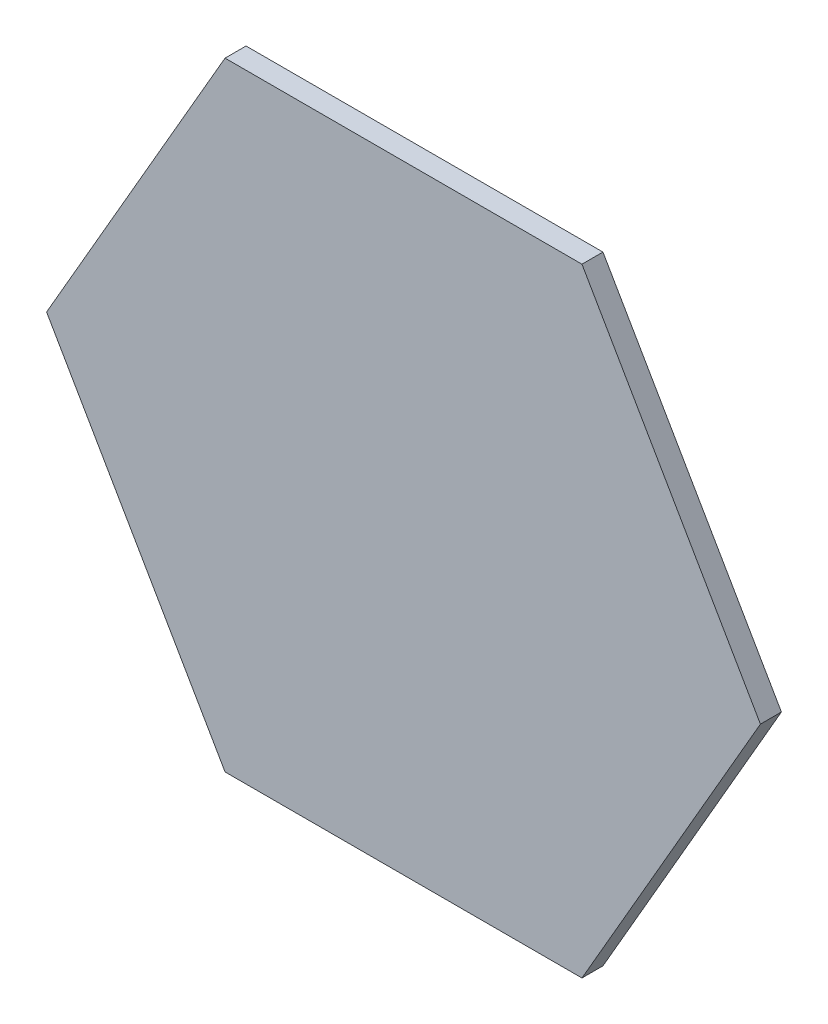
ISO-10303-21;
HEADER;
FILE_DESCRIPTION(('STEP AP214'),'2;1');
FILE_NAME('part.step','',(''),(''),'','','');
FILE_SCHEMA(('AUTOMOTIVE_DESIGN { 1 0 10303 214 1 1 1 1 }'));
ENDSEC;
DATA;
#1=APPLICATION_CONTEXT('core data for automotive mechanical design processes');
#2=APPLICATION_PROTOCOL_DEFINITION('international standard','automotive_design',2000,#1);
#3=PRODUCT_CONTEXT('',#1,'mechanical');
#4=PRODUCT('Part','Part','',(#3));
#5=PRODUCT_RELATED_PRODUCT_CATEGORY('part','',(#4));
#6=PRODUCT_DEFINITION_FORMATION('','',#4);
#7=PRODUCT_DEFINITION_CONTEXT('part definition',#1,'design');
#8=PRODUCT_DEFINITION('design','',#6,#7);
#9=PRODUCT_DEFINITION_SHAPE('','',#8);
#10=(LENGTH_UNIT() NAMED_UNIT(*) SI_UNIT(.MILLI.,.METRE.));
#11=(NAMED_UNIT(*) PLANE_ANGLE_UNIT() SI_UNIT($,.RADIAN.));
#12=(NAMED_UNIT(*) SI_UNIT($,.STERADIAN.) SOLID_ANGLE_UNIT());
#13=UNCERTAINTY_MEASURE_WITH_UNIT(LENGTH_MEASURE(1.E-05),#10,'distance_accuracy_value','');
#14=(GEOMETRIC_REPRESENTATION_CONTEXT(3) GLOBAL_UNCERTAINTY_ASSIGNED_CONTEXT((#13)) GLOBAL_UNIT_ASSIGNED_CONTEXT((#10,
#11,#12)) REPRESENTATION_CONTEXT('',''));
#15=CARTESIAN_POINT('',(0.,0.,0.));
#16=DIRECTION('',(0.,0.,1.));
#17=DIRECTION('',(1.,0.,0.));
#18=AXIS2_PLACEMENT_3D('',#15,#16,#17);
#19=CARTESIAN_POINT('',(17.0000000000003,-29.4448637286707,2.));
#20=DIRECTION('',(-0.866025403784441,0.499999999999995,0.));
#21=DIRECTION('',(-0.499999999999995,-0.866025403784442,0.));
#22=AXIS2_PLACEMENT_3D('',#19,#20,#21);
#23=PLANE('',#22);
#24=DIRECTION('',(0.499999999999995,0.866025403784441,0.));
#25=VECTOR('',#24,1.);
#26=CARTESIAN_POINT('',(17.0000000000003,-29.4448637286707,0.));
#27=LINE('',#26,#25);
#28=CARTESIAN_POINT('',(17.0000000000003,-29.4448637286707,0.));
#29=VERTEX_POINT('',#28);
#30=CARTESIAN_POINT('',(33.9999999999999,0.,0.));
#31=VERTEX_POINT('',#30);
#32=EDGE_CURVE('E117',#29,#31,#27,.T.);
#33=ORIENTED_EDGE('',*,*,#32,.T.);
#34=DIRECTION('',(0.,0.,-1.));
#35=VECTOR('',#34,1.);
#36=CARTESIAN_POINT('',(33.9999999999999,0.,2.));
#37=LINE('',#36,#35);
#38=CARTESIAN_POINT('',(33.9999999999999,0.,2.));
#39=VERTEX_POINT('',#38);
#40=EDGE_CURVE('E11',#39,#31,#37,.T.);
#41=ORIENTED_EDGE('',*,*,#40,.F.);
#42=DIRECTION('',(0.499999999999995,0.866025403784441,0.));
#43=VECTOR('',#42,1.);
#44=CARTESIAN_POINT('',(17.0000000000003,-29.4448637286707,2.));
#45=LINE('',#44,#43);
#46=CARTESIAN_POINT('',(17.0000000000003,-29.4448637286707,2.));
#47=VERTEX_POINT('',#46);
#48=EDGE_CURVE('E127',#47,#39,#45,.T.);
#49=ORIENTED_EDGE('',*,*,#48,.F.);
#50=DIRECTION('',(0.,0.,-1.));
#51=VECTOR('',#50,1.);
#52=CARTESIAN_POINT('',(17.0000000000003,-29.4448637286707,2.));
#53=LINE('',#52,#51);
#54=EDGE_CURVE('E113',#47,#29,#53,.T.);
#55=ORIENTED_EDGE('',*,*,#54,.T.);
#56=EDGE_LOOP('',(#33,#41,#49,#55));
#57=FACE_BOUND('',#56,.T.);
#58=ADVANCED_FACE('F33',(#57),#23,.F.);
#59=CARTESIAN_POINT('',(33.9999999999999,0.,2.));
#60=DIRECTION('',(-0.866025403784438,-0.500000000000001,0.));
#61=DIRECTION('',(0.500000000000001,-0.866025403784438,0.));
#62=AXIS2_PLACEMENT_3D('',#59,#60,#61);
#63=PLANE('',#62);
#64=DIRECTION('',(-0.500000000000001,0.866025403784438,0.));
#65=VECTOR('',#64,1.);
#66=CARTESIAN_POINT('',(33.9999999999999,0.,0.));
#67=LINE('',#66,#65);
#68=CARTESIAN_POINT('',(16.9999999999999,29.4448637286709,0.));
#69=VERTEX_POINT('',#68);
#70=EDGE_CURVE('E120',#31,#69,#67,.T.);
#71=ORIENTED_EDGE('',*,*,#70,.T.);
#72=DIRECTION('',(0.,0.,-1.));
#73=VECTOR('',#72,1.);
#74=CARTESIAN_POINT('',(16.9999999999999,29.4448637286709,2.));
#75=LINE('',#74,#73);
#76=CARTESIAN_POINT('',(16.9999999999999,29.4448637286709,2.));
#77=VERTEX_POINT('',#76);
#78=EDGE_CURVE('E41',#77,#69,#75,.T.);
#79=ORIENTED_EDGE('',*,*,#78,.F.);
#80=DIRECTION('',(-0.500000000000001,0.866025403784438,0.));
#81=VECTOR('',#80,1.);
#82=CARTESIAN_POINT('',(33.9999999999999,0.,2.));
#83=LINE('',#82,#81);
#84=EDGE_CURVE('E86',#39,#77,#83,.T.);
#85=ORIENTED_EDGE('',*,*,#84,.F.);
#86=ORIENTED_EDGE('',*,*,#40,.T.);
#87=EDGE_LOOP('',(#71,#79,#85,#86));
#88=FACE_BOUND('',#87,.T.);
#89=ADVANCED_FACE('F151',(#88),#63,.F.);
#90=CARTESIAN_POINT('',(16.9999999999999,29.4448637286709,2.));
#91=DIRECTION('',(0.,-1.,0.));
#92=DIRECTION('',(1.,0.,0.));
#93=AXIS2_PLACEMENT_3D('',#90,#91,#92);
#94=PLANE('',#93);
#95=DIRECTION('',(-1.,0.,0.));
#96=VECTOR('',#95,1.);
#97=CARTESIAN_POINT('',(16.9999999999999,29.4448637286709,0.));
#98=LINE('',#97,#96);
#99=CARTESIAN_POINT('',(-17.0000000000001,29.4448637286708,0.));
#100=VERTEX_POINT('',#99);
#101=EDGE_CURVE('E122',#69,#100,#98,.T.);
#102=ORIENTED_EDGE('',*,*,#101,.T.);
#103=DIRECTION('',(0.,0.,-1.));
#104=VECTOR('',#103,1.);
#105=CARTESIAN_POINT('',(-17.0000000000001,29.4448637286708,2.));
#106=LINE('',#105,#104);
#107=CARTESIAN_POINT('',(-17.0000000000001,29.4448637286708,2.));
#108=VERTEX_POINT('',#107);
#109=EDGE_CURVE('E108',#108,#100,#106,.T.);
#110=ORIENTED_EDGE('',*,*,#109,.F.);
#111=DIRECTION('',(-1.,0.,0.));
#112=VECTOR('',#111,1.);
#113=CARTESIAN_POINT('',(16.9999999999999,29.4448637286709,2.));
#114=LINE('',#113,#112);
#115=EDGE_CURVE('E99',#77,#108,#114,.T.);
#116=ORIENTED_EDGE('',*,*,#115,.F.);
#117=ORIENTED_EDGE('',*,*,#78,.T.);
#118=EDGE_LOOP('',(#102,#110,#116,#117));
#119=FACE_BOUND('',#118,.T.);
#120=ADVANCED_FACE('F133',(#119),#94,.F.);
#121=CARTESIAN_POINT('',(-17.0000000000001,29.4448637286708,2.));
#122=DIRECTION('',(0.866025403784441,-0.499999999999995,0.));
#123=DIRECTION('',(0.499999999999995,0.866025403784442,0.));
#124=AXIS2_PLACEMENT_3D('',#121,#122,#123);
#125=PLANE('',#124);
#126=DIRECTION('',(-0.499999999999995,-0.866025403784442,0.));
#127=VECTOR('',#126,1.);
#128=CARTESIAN_POINT('',(-17.0000000000001,29.4448637286708,0.));
#129=LINE('',#128,#127);
#130=CARTESIAN_POINT('',(-33.9999999999999,-2.37420731041333E-13,0.));
#131=VERTEX_POINT('',#130);
#132=EDGE_CURVE('E107',#100,#131,#129,.T.);
#133=ORIENTED_EDGE('',*,*,#132,.T.);
#134=DIRECTION('',(0.,0.,-1.));
#135=VECTOR('',#134,1.);
#136=CARTESIAN_POINT('',(-33.9999999999999,-2.37420731041333E-13,2.));
#137=LINE('',#136,#135);
#138=CARTESIAN_POINT('',(-33.9999999999999,-2.37420731041333E-13,2.));
#139=VERTEX_POINT('',#138);
#140=EDGE_CURVE('E104',#139,#131,#137,.T.);
#141=ORIENTED_EDGE('',*,*,#140,.F.);
#142=DIRECTION('',(-0.499999999999995,-0.866025403784442,0.));
#143=VECTOR('',#142,1.);
#144=CARTESIAN_POINT('',(-17.0000000000001,29.4448637286708,2.));
#145=LINE('',#144,#143);
#146=EDGE_CURVE('E93',#108,#139,#145,.T.);
#147=ORIENTED_EDGE('',*,*,#146,.F.);
#148=ORIENTED_EDGE('',*,*,#109,.T.);
#149=EDGE_LOOP('',(#133,#141,#147,#148));
#150=FACE_BOUND('',#149,.T.);
#151=ADVANCED_FACE('F105',(#150),#125,.F.);
#152=CARTESIAN_POINT('',(-33.9999999999999,-2.37420731041333E-13,2.));
#153=DIRECTION('',(0.866025403784435,0.500000000000007,0.));
#154=DIRECTION('',(-0.500000000000007,0.866025403784435,0.));
#155=AXIS2_PLACEMENT_3D('',#152,#153,#154);
#156=PLANE('',#155);
#157=DIRECTION('',(0.500000000000007,-0.866025403784435,0.));
#158=VECTOR('',#157,1.);
#159=CARTESIAN_POINT('',(-33.9999999999999,-2.37420731041333E-13,0.));
#160=LINE('',#159,#158);
#161=CARTESIAN_POINT('',(-16.9999999999997,-29.444863728671,0.));
#162=VERTEX_POINT('',#161);
#163=EDGE_CURVE('E72',#131,#162,#160,.T.);
#164=ORIENTED_EDGE('',*,*,#163,.T.);
#165=DIRECTION('',(0.,0.,-1.));
#166=VECTOR('',#165,1.);
#167=CARTESIAN_POINT('',(-16.9999999999997,-29.444863728671,2.));
#168=LINE('',#167,#166);
#169=CARTESIAN_POINT('',(-16.9999999999997,-29.444863728671,2.));
#170=VERTEX_POINT('',#169);
#171=EDGE_CURVE('E109',#170,#162,#168,.T.);
#172=ORIENTED_EDGE('',*,*,#171,.F.);
#173=DIRECTION('',(0.500000000000007,-0.866025403784435,0.));
#174=VECTOR('',#173,1.);
#175=CARTESIAN_POINT('',(-33.9999999999999,-2.37420731041333E-13,2.));
#176=LINE('',#175,#174);
#177=EDGE_CURVE('E97',#139,#170,#176,.T.);
#178=ORIENTED_EDGE('',*,*,#177,.F.);
#179=ORIENTED_EDGE('',*,*,#140,.T.);
#180=EDGE_LOOP('',(#164,#172,#178,#179));
#181=FACE_BOUND('',#180,.T.);
#182=ADVANCED_FACE('F111',(#181),#156,.F.);
#183=CARTESIAN_POINT('',(-16.9999999999997,-29.444863728671,2.));
#184=DIRECTION('',(0.,1.,0.));
#185=DIRECTION('',(-1.,0.,0.));
#186=AXIS2_PLACEMENT_3D('',#183,#184,#185);
#187=PLANE('',#186);
#188=DIRECTION('',(1.,0.,0.));
#189=VECTOR('',#188,1.);
#190=CARTESIAN_POINT('',(-16.9999999999997,-29.444863728671,0.));
#191=LINE('',#190,#189);
#192=EDGE_CURVE('E78',#162,#29,#191,.T.);
#193=ORIENTED_EDGE('',*,*,#192,.T.);
#194=ORIENTED_EDGE('',*,*,#54,.F.);
#195=DIRECTION('',(1.,0.,0.));
#196=VECTOR('',#195,1.);
#197=CARTESIAN_POINT('',(-16.9999999999997,-29.444863728671,2.));
#198=LINE('',#197,#196);
#199=EDGE_CURVE('E49',#170,#47,#198,.T.);
#200=ORIENTED_EDGE('',*,*,#199,.F.);
#201=ORIENTED_EDGE('',*,*,#171,.T.);
#202=EDGE_LOOP('',(#193,#194,#200,#201));
#203=FACE_BOUND('',#202,.T.);
#204=ADVANCED_FACE('F140',(#203),#187,.F.);
#205=CARTESIAN_POINT('',(0.,0.,2.));
#206=DIRECTION('',(0.,0.,1.));
#207=DIRECTION('',(1.,0.,0.));
#208=AXIS2_PLACEMENT_3D('',#205,#206,#207);
#209=PLANE('',#208);
#210=ORIENTED_EDGE('',*,*,#48,.T.);
#211=ORIENTED_EDGE('',*,*,#84,.T.);
#212=ORIENTED_EDGE('',*,*,#115,.T.);
#213=ORIENTED_EDGE('',*,*,#146,.T.);
#214=ORIENTED_EDGE('',*,*,#177,.T.);
#215=ORIENTED_EDGE('',*,*,#199,.T.);
#216=EDGE_LOOP('',(#210,#211,#212,#213,#214,#215));
#217=FACE_BOUND('',#216,.T.);
#218=ADVANCED_FACE('F95',(#217),#209,.T.);
#219=CARTESIAN_POINT('',(0.,0.,0.));
#220=DIRECTION('',(0.,0.,1.));
#221=DIRECTION('',(1.,0.,0.));
#222=AXIS2_PLACEMENT_3D('',#219,#220,#221);
#223=PLANE('',#222);
#224=ORIENTED_EDGE('',*,*,#32,.F.);
#225=ORIENTED_EDGE('',*,*,#192,.F.);
#226=ORIENTED_EDGE('',*,*,#163,.F.);
#227=ORIENTED_EDGE('',*,*,#132,.F.);
#228=ORIENTED_EDGE('',*,*,#101,.F.);
#229=ORIENTED_EDGE('',*,*,#70,.F.);
#230=EDGE_LOOP('',(#224,#225,#226,#227,#228,#229));
#231=FACE_BOUND('',#230,.T.);
#232=ADVANCED_FACE('F136',(#231),#223,.F.);
#233=CLOSED_SHELL('',(#58,#89,#120,#151,#182,#204,#218,#232));
#234=MANIFOLD_SOLID_BREP('B2',#233);
#235=ADVANCED_BREP_SHAPE_REPRESENTATION('',(#18,#234),#14);
#236=SHAPE_DEFINITION_REPRESENTATION(#9,#235);
ENDSEC;
END-ISO-10303-21;
